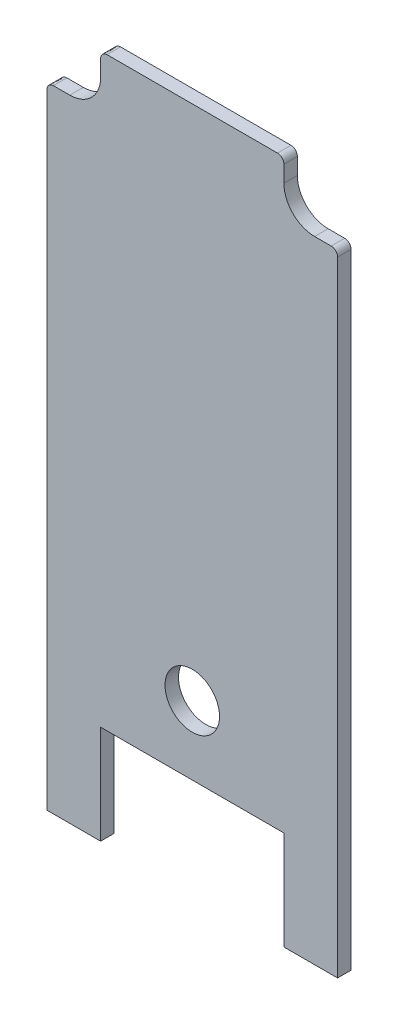
ISO-10303-21;
HEADER;
FILE_DESCRIPTION(('STEP AP214'),'2;1');
FILE_NAME('part.step','',(''),(''),'','','');
FILE_SCHEMA(('AUTOMOTIVE_DESIGN { 1 0 10303 214 1 1 1 1 }'));
ENDSEC;
DATA;
#1=APPLICATION_CONTEXT('core data for automotive mechanical design processes');
#2=APPLICATION_PROTOCOL_DEFINITION('international standard','automotive_design',2000,#1);
#3=PRODUCT_CONTEXT('',#1,'mechanical');
#4=PRODUCT('Part','Part','',(#3));
#5=PRODUCT_RELATED_PRODUCT_CATEGORY('part','',(#4));
#6=PRODUCT_DEFINITION_FORMATION('','',#4);
#7=PRODUCT_DEFINITION_CONTEXT('part definition',#1,'design');
#8=PRODUCT_DEFINITION('design','',#6,#7);
#9=PRODUCT_DEFINITION_SHAPE('','',#8);
#10=(LENGTH_UNIT() NAMED_UNIT(*) SI_UNIT(.MILLI.,.METRE.));
#11=(NAMED_UNIT(*) PLANE_ANGLE_UNIT() SI_UNIT($,.RADIAN.));
#12=(NAMED_UNIT(*) SI_UNIT($,.STERADIAN.) SOLID_ANGLE_UNIT());
#13=UNCERTAINTY_MEASURE_WITH_UNIT(LENGTH_MEASURE(1.E-05),#10,'distance_accuracy_value','');
#14=(GEOMETRIC_REPRESENTATION_CONTEXT(3) GLOBAL_UNCERTAINTY_ASSIGNED_CONTEXT((#13)) GLOBAL_UNIT_ASSIGNED_CONTEXT((#10,
#11,#12)) REPRESENTATION_CONTEXT('',''));
#15=CARTESIAN_POINT('',(0.,0.,0.));
#16=DIRECTION('',(0.,0.,1.));
#17=DIRECTION('',(1.,0.,0.));
#18=AXIS2_PLACEMENT_3D('',#15,#16,#17);
#19=CARTESIAN_POINT('',(16.17485166992,37.7205089948946,6.57));
#20=CARTESIAN_POINT('',(16.268017422358,37.7205089948946,6.57));
#21=CARTESIAN_POINT('',(16.450238191191,37.6884642471952,6.57));
#22=CARTESIAN_POINT('',(16.7185532302932,37.5185532302922,6.57));
#23=CARTESIAN_POINT('',(16.8884642471962,37.25023819119,6.57));
#24=CARTESIAN_POINT('',(16.9205089948956,37.068017422357,6.57));
#25=CARTESIAN_POINT('',(16.9205089948956,36.974851669919,6.57));
#26=B_SPLINE_CURVE_WITH_KNOTS('',3,(#19,#20,#21,#22,#23,#24,#25),.UNSPECIFIED.,.F.,.F.,(4,1,1,1,
4),(0.,0.25,0.5,0.75,1.),.UNSPECIFIED.);
#27=DIRECTION('',(0.,0.,-1.));
#28=VECTOR('',#27,1.);
#29=SURFACE_OF_LINEAR_EXTRUSION('',#26,#28);
#30=CARTESIAN_POINT('',(16.17485166992,37.7205089948946,5.));
#31=CARTESIAN_POINT('',(16.268017422358,37.7205089948946,5.));
#32=CARTESIAN_POINT('',(16.450238191191,37.6884642471952,5.));
#33=CARTESIAN_POINT('',(16.7185532302932,37.5185532302922,5.));
#34=CARTESIAN_POINT('',(16.8884642471962,37.25023819119,5.));
#35=CARTESIAN_POINT('',(16.9205089948956,37.068017422357,5.));
#36=CARTESIAN_POINT('',(16.9205089948956,36.974851669919,5.));
#37=B_SPLINE_CURVE_WITH_KNOTS('',3,(#30,#31,#32,#33,#34,#35,#36),.UNSPECIFIED.,.F.,.F.,(4,1,1,1,
4),(0.,0.25,0.5,0.75,1.),.UNSPECIFIED.);
#38=CARTESIAN_POINT('',(16.17485166992,37.7205089948946,5.));
#39=VERTEX_POINT('',#38);
#40=CARTESIAN_POINT('',(16.9205089948956,36.974851669919,5.));
#41=VERTEX_POINT('',#40);
#42=EDGE_CURVE('E285',#39,#41,#37,.T.);
#43=ORIENTED_EDGE('',*,*,#42,.F.);
#44=DIRECTION('',(0.,0.,-1.));
#45=VECTOR('',#44,1.);
#46=CARTESIAN_POINT('',(16.17485166992,37.7205089948946,6.57));
#47=LINE('',#46,#45);
#48=CARTESIAN_POINT('',(16.17485166992,37.7205089948946,6.57));
#49=VERTEX_POINT('',#48);
#50=EDGE_CURVE('E125',#49,#39,#47,.T.);
#51=ORIENTED_EDGE('',*,*,#50,.F.);
#52=CARTESIAN_POINT('',(16.9205089948956,36.974851669919,6.57));
#53=VERTEX_POINT('',#52);
#54=EDGE_CURVE('E230',#49,#53,#26,.T.);
#55=ORIENTED_EDGE('',*,*,#54,.T.);
#56=DIRECTION('',(0.,0.,-1.));
#57=VECTOR('',#56,1.);
#58=CARTESIAN_POINT('',(16.9205089948956,36.974851669919,6.57));
#59=LINE('',#58,#57);
#60=EDGE_CURVE('E223',#53,#41,#59,.T.);
#61=ORIENTED_EDGE('',*,*,#60,.T.);
#62=EDGE_LOOP('',(#43,#51,#55,#61));
#63=FACE_BOUND('',#62,.T.);
#64=ADVANCED_FACE('F115',(#63),#29,.T.);
#65=CARTESIAN_POINT('',(-5.84707923333038E-12,37.7205089948921,6.57));
#66=DIRECTION('',(-1.55010613301166E-13,1.,0.));
#67=DIRECTION('',(-1.,-1.55010613301166E-13,0.));
#68=AXIS2_PLACEMENT_3D('',#65,#66,#67);
#69=PLANE('',#68);
#70=DIRECTION('',(1.,1.55010613301166E-13,0.));
#71=VECTOR('',#70,1.);
#72=CARTESIAN_POINT('',(-5.84707923333038E-12,37.7205089948921,5.));
#73=LINE('',#72,#71);
#74=CARTESIAN_POINT('',(14.2500000000004,37.7205089948943,5.));
#75=VERTEX_POINT('',#74);
#76=EDGE_CURVE('E282',#75,#39,#73,.T.);
#77=ORIENTED_EDGE('',*,*,#76,.F.);
#78=DIRECTION('',(0.,0.,-1.));
#79=VECTOR('',#78,1.);
#80=CARTESIAN_POINT('',(14.2500000000004,37.7205089948943,6.57));
#81=LINE('',#80,#79);
#82=CARTESIAN_POINT('',(14.2500000000004,37.7205089948943,6.57));
#83=VERTEX_POINT('',#82);
#84=EDGE_CURVE('E186',#83,#75,#81,.T.);
#85=ORIENTED_EDGE('',*,*,#84,.F.);
#86=DIRECTION('',(1.,1.55010613301166E-13,0.));
#87=VECTOR('',#86,1.);
#88=CARTESIAN_POINT('',(-5.84707923333038E-12,37.7205089948921,6.57));
#89=LINE('',#88,#87);
#90=EDGE_CURVE('E472',#83,#49,#89,.T.);
#91=ORIENTED_EDGE('',*,*,#90,.T.);
#92=ORIENTED_EDGE('',*,*,#50,.T.);
#93=EDGE_LOOP('',(#77,#85,#91,#92));
#94=FACE_BOUND('',#93,.T.);
#95=ADVANCED_FACE('F471',(#94),#69,.T.);
#96=CARTESIAN_POINT('',(14.2500000000014,41.2999999999997,6.57));
#97=DIRECTION('',(0.,0.,-1.));
#98=DIRECTION('',(-1.,0.,0.));
#99=AXIS2_PLACEMENT_3D('',#96,#97,#98);
#100=CYLINDRICAL_SURFACE('',#99,3.57949100510564);
#101=CARTESIAN_POINT('',(14.2500000000014,41.2999999999997,5.));
#102=DIRECTION('',(0.,0.,1.));
#103=DIRECTION('',(1.,0.,0.));
#104=AXIS2_PLACEMENT_3D('',#101,#102,#103);
#105=CIRCLE('',#104,3.57949100510564);
#106=CARTESIAN_POINT('',(10.6705089948956,41.2999999999997,5.));
#107=VERTEX_POINT('',#106);
#108=EDGE_CURVE('E279',#107,#75,#105,.T.);
#109=ORIENTED_EDGE('',*,*,#108,.F.);
#110=DIRECTION('',(0.,0.,-1.));
#111=VECTOR('',#110,1.);
#112=CARTESIAN_POINT('',(10.6705089948956,41.2999999999997,6.57));
#113=LINE('',#112,#111);
#114=CARTESIAN_POINT('',(10.6705089948956,41.2999999999997,6.57));
#115=VERTEX_POINT('',#114);
#116=EDGE_CURVE('E189',#115,#107,#113,.T.);
#117=ORIENTED_EDGE('',*,*,#116,.F.);
#118=CARTESIAN_POINT('',(14.2500000000014,41.2999999999997,6.57));
#119=DIRECTION('',(0.,0.,1.));
#120=DIRECTION('',(1.,0.,0.));
#121=AXIS2_PLACEMENT_3D('',#118,#119,#120);
#122=CIRCLE('',#121,3.57949100510564);
#123=EDGE_CURVE('E467',#115,#83,#122,.T.);
#124=ORIENTED_EDGE('',*,*,#123,.T.);
#125=ORIENTED_EDGE('',*,*,#84,.T.);
#126=EDGE_LOOP('',(#109,#117,#124,#125));
#127=FACE_BOUND('',#126,.T.);
#128=ADVANCED_FACE('F464',(#127),#100,.F.);
#129=CARTESIAN_POINT('',(10.6705089948951,-1.25014813174112E-13,6.57));
#130=DIRECTION('',(1.,0.,0.));
#131=DIRECTION('',(0.,1.,0.));
#132=AXIS2_PLACEMENT_3D('',#129,#130,#131);
#133=PLANE('',#132);
#134=DIRECTION('',(0.,-1.,0.));
#135=VECTOR('',#134,1.);
#136=CARTESIAN_POINT('',(10.6705089948951,-1.25014813174112E-13,5.));
#137=LINE('',#136,#135);
#138=CARTESIAN_POINT('',(10.6705089948956,43.2248516699192,5.));
#139=VERTEX_POINT('',#138);
#140=EDGE_CURVE('E273',#139,#107,#137,.T.);
#141=ORIENTED_EDGE('',*,*,#140,.F.);
#142=DIRECTION('',(0.,0.,-1.));
#143=VECTOR('',#142,1.);
#144=CARTESIAN_POINT('',(10.6705089948956,43.2248516699192,6.57));
#145=LINE('',#144,#143);
#146=CARTESIAN_POINT('',(10.6705089948956,43.2248516699192,6.57));
#147=VERTEX_POINT('',#146);
#148=EDGE_CURVE('E192',#147,#139,#145,.T.);
#149=ORIENTED_EDGE('',*,*,#148,.F.);
#150=DIRECTION('',(0.,-1.,0.));
#151=VECTOR('',#150,1.);
#152=CARTESIAN_POINT('',(10.6705089948951,-1.25014813174112E-13,6.57));
#153=LINE('',#152,#151);
#154=EDGE_CURVE('E514',#147,#115,#153,.T.);
#155=ORIENTED_EDGE('',*,*,#154,.T.);
#156=ORIENTED_EDGE('',*,*,#116,.T.);
#157=EDGE_LOOP('',(#141,#149,#155,#156));
#158=FACE_BOUND('',#157,.T.);
#159=ADVANCED_FACE('F460',(#158),#133,.T.);
#160=CARTESIAN_POINT('',(9.92485166992008,43.9705089948948,6.57));
#161=CARTESIAN_POINT('',(10.0180174223581,43.9705089948948,6.57));
#162=CARTESIAN_POINT('',(10.2002381911911,43.9384642471954,6.57));
#163=CARTESIAN_POINT('',(10.4685532302933,43.7685532302924,6.57));
#164=CARTESIAN_POINT('',(10.6384642471963,43.5002381911902,6.57));
#165=CARTESIAN_POINT('',(10.6705089948956,43.3180174223572,6.57));
#166=CARTESIAN_POINT('',(10.6705089948956,43.2248516699192,6.57));
#167=B_SPLINE_CURVE_WITH_KNOTS('',3,(#160,#161,#162,#163,#164,#165,#166),.UNSPECIFIED.,.F.,.F.,
(4,1,1,1,4),(0.,0.25,0.5,0.75,1.),.UNSPECIFIED.);
#168=DIRECTION('',(0.,0.,-1.));
#169=VECTOR('',#168,1.);
#170=SURFACE_OF_LINEAR_EXTRUSION('',#167,#169);
#171=CARTESIAN_POINT('',(9.92485166992008,43.9705089948948,5.));
#172=CARTESIAN_POINT('',(10.0180174223581,43.9705089948948,5.));
#173=CARTESIAN_POINT('',(10.2002381911911,43.9384642471954,5.));
#174=CARTESIAN_POINT('',(10.4685532302933,43.7685532302924,5.));
#175=CARTESIAN_POINT('',(10.6384642471963,43.5002381911902,5.));
#176=CARTESIAN_POINT('',(10.6705089948956,43.3180174223572,5.));
#177=CARTESIAN_POINT('',(10.6705089948956,43.2248516699192,5.));
#178=B_SPLINE_CURVE_WITH_KNOTS('',3,(#171,#172,#173,#174,#175,#176,#177),.UNSPECIFIED.,.F.,.F.,
(4,1,1,1,4),(0.,0.25,0.5,0.75,1.),.UNSPECIFIED.);
#179=CARTESIAN_POINT('',(9.92485166992008,43.9705089948948,5.));
#180=VERTEX_POINT('',#179);
#181=EDGE_CURVE('E268',#180,#139,#178,.T.);
#182=ORIENTED_EDGE('',*,*,#181,.F.);
#183=DIRECTION('',(0.,0.,-1.));
#184=VECTOR('',#183,1.);
#185=CARTESIAN_POINT('',(9.92485166992008,43.9705089948948,6.57));
#186=LINE('',#185,#184);
#187=CARTESIAN_POINT('',(9.92485166992008,43.9705089948948,6.57));
#188=VERTEX_POINT('',#187);
#189=EDGE_CURVE('E195',#188,#180,#186,.T.);
#190=ORIENTED_EDGE('',*,*,#189,.F.);
#191=EDGE_CURVE('E456',#188,#147,#167,.T.);
#192=ORIENTED_EDGE('',*,*,#191,.T.);
#193=ORIENTED_EDGE('',*,*,#148,.T.);
#194=EDGE_LOOP('',(#182,#190,#192,#193));
#195=FACE_BOUND('',#194,.T.);
#196=ADVANCED_FACE('F454',(#195),#170,.T.);
#197=CARTESIAN_POINT('',(7.3780052006081E-13,43.9705089948949,6.57));
#198=DIRECTION('',(0.,1.,0.));
#199=DIRECTION('',(-1.,0.,0.));
#200=AXIS2_PLACEMENT_3D('',#197,#198,#199);
#201=PLANE('',#200);
#202=DIRECTION('',(1.,0.,0.));
#203=VECTOR('',#202,1.);
#204=CARTESIAN_POINT('',(7.3780052006081E-13,43.9705089948949,5.));
#205=LINE('',#204,#203);
#206=CARTESIAN_POINT('',(-9.92485166991887,43.9705089948951,5.));
#207=VERTEX_POINT('',#206);
#208=EDGE_CURVE('E262',#207,#180,#205,.T.);
#209=ORIENTED_EDGE('',*,*,#208,.F.);
#210=DIRECTION('',(0.,0.,-1.));
#211=VECTOR('',#210,1.);
#212=CARTESIAN_POINT('',(-9.92485166991887,43.9705089948951,6.57));
#213=LINE('',#212,#211);
#214=CARTESIAN_POINT('',(-9.92485166991887,43.9705089948951,6.57));
#215=VERTEX_POINT('',#214);
#216=EDGE_CURVE('E198',#215,#207,#213,.T.);
#217=ORIENTED_EDGE('',*,*,#216,.F.);
#218=DIRECTION('',(1.,0.,0.));
#219=VECTOR('',#218,1.);
#220=CARTESIAN_POINT('',(7.3780052006081E-13,43.9705089948949,6.57));
#221=LINE('',#220,#219);
#222=EDGE_CURVE('E353',#215,#188,#221,.T.);
#223=ORIENTED_EDGE('',*,*,#222,.T.);
#224=ORIENTED_EDGE('',*,*,#189,.T.);
#225=EDGE_LOOP('',(#209,#217,#223,#224));
#226=FACE_BOUND('',#225,.T.);
#227=ADVANCED_FACE('F342',(#226),#201,.T.);
#228=CARTESIAN_POINT('',(-10.6705089948944,43.2248516699195,6.57));
#229=CARTESIAN_POINT('',(-10.6705089948944,43.3180174223576,6.57));
#230=CARTESIAN_POINT('',(-10.6384642471951,43.5002381911905,6.57));
#231=CARTESIAN_POINT('',(-10.4685532302921,43.7685532302927,6.57));
#232=CARTESIAN_POINT('',(-10.2002381911899,43.9384642471958,6.57));
#233=CARTESIAN_POINT('',(-10.0180174223569,43.9705089948951,6.57));
#234=CARTESIAN_POINT('',(-9.92485166991887,43.9705089948951,6.57));
#235=B_SPLINE_CURVE_WITH_KNOTS('',3,(#228,#229,#230,#231,#232,#233,#234),.UNSPECIFIED.,.F.,.F.,
(4,1,1,1,4),(0.,0.25,0.5,0.75,1.),.UNSPECIFIED.);
#236=DIRECTION('',(0.,0.,-1.));
#237=VECTOR('',#236,1.);
#238=SURFACE_OF_LINEAR_EXTRUSION('',#235,#237);
#239=CARTESIAN_POINT('',(-10.6705089948944,43.2248516699195,5.));
#240=CARTESIAN_POINT('',(-10.6705089948944,43.3180174223576,5.));
#241=CARTESIAN_POINT('',(-10.6384642471951,43.5002381911905,5.));
#242=CARTESIAN_POINT('',(-10.4685532302921,43.7685532302927,5.));
#243=CARTESIAN_POINT('',(-10.2002381911899,43.9384642471958,5.));
#244=CARTESIAN_POINT('',(-10.0180174223569,43.9705089948951,5.));
#245=CARTESIAN_POINT('',(-9.92485166991887,43.9705089948951,5.));
#246=B_SPLINE_CURVE_WITH_KNOTS('',3,(#239,#240,#241,#242,#243,#244,#245),.UNSPECIFIED.,.F.,.F.,
(4,1,1,1,4),(0.,0.25,0.5,0.75,1.),.UNSPECIFIED.);
#247=CARTESIAN_POINT('',(-10.6705089948944,43.2248516699195,5.));
#248=VERTEX_POINT('',#247);
#249=EDGE_CURVE('E257',#248,#207,#246,.T.);
#250=ORIENTED_EDGE('',*,*,#249,.F.);
#251=DIRECTION('',(0.,0.,-1.));
#252=VECTOR('',#251,1.);
#253=CARTESIAN_POINT('',(-10.6705089948944,43.2248516699195,6.57));
#254=LINE('',#253,#252);
#255=CARTESIAN_POINT('',(-10.6705089948944,43.2248516699195,6.57));
#256=VERTEX_POINT('',#255);
#257=EDGE_CURVE('E201',#256,#248,#254,.T.);
#258=ORIENTED_EDGE('',*,*,#257,.F.);
#259=EDGE_CURVE('E345',#256,#215,#235,.T.);
#260=ORIENTED_EDGE('',*,*,#259,.T.);
#261=ORIENTED_EDGE('',*,*,#216,.T.);
#262=EDGE_LOOP('',(#250,#258,#260,#261));
#263=FACE_BOUND('',#262,.T.);
#264=ADVANCED_FACE('F337',(#263),#238,.T.);
#265=CARTESIAN_POINT('',(-10.6705089948839,-2.59646150438281E-12,6.57));
#266=DIRECTION('',(-1.,-2.43330613903021E-13,0.));
#267=DIRECTION('',(2.43330613903021E-13,-1.,0.));
#268=AXIS2_PLACEMENT_3D('',#265,#266,#267);
#269=PLANE('',#268);
#270=DIRECTION('',(-2.43330613903021E-13,1.,0.));
#271=VECTOR('',#270,1.);
#272=CARTESIAN_POINT('',(-10.6705089948839,-2.59646150438281E-12,5.));
#273=LINE('',#272,#271);
#274=CARTESIAN_POINT('',(-10.670508994894,41.3000000000002,5.));
#275=VERTEX_POINT('',#274);
#276=EDGE_CURVE('E254',#275,#248,#273,.T.);
#277=ORIENTED_EDGE('',*,*,#276,.F.);
#278=DIRECTION('',(0.,0.,-1.));
#279=VECTOR('',#278,1.);
#280=CARTESIAN_POINT('',(-10.670508994894,41.3000000000002,6.57));
#281=LINE('',#280,#279);
#282=CARTESIAN_POINT('',(-10.670508994894,41.3000000000002,6.57));
#283=VERTEX_POINT('',#282);
#284=EDGE_CURVE('E204',#283,#275,#281,.T.);
#285=ORIENTED_EDGE('',*,*,#284,.F.);
#286=DIRECTION('',(-2.43330613903021E-13,1.,0.));
#287=VECTOR('',#286,1.);
#288=CARTESIAN_POINT('',(-10.6705089948839,-2.59646150438281E-12,6.57));
#289=LINE('',#288,#287);
#290=EDGE_CURVE('E352',#283,#256,#289,.T.);
#291=ORIENTED_EDGE('',*,*,#290,.T.);
#292=ORIENTED_EDGE('',*,*,#257,.T.);
#293=EDGE_LOOP('',(#277,#285,#291,#292));
#294=FACE_BOUND('',#293,.T.);
#295=ADVANCED_FACE('F333',(#294),#269,.T.);
#296=CARTESIAN_POINT('',(-14.2499999999986,41.3000000000003,6.57));
#297=DIRECTION('',(0.,0.,-1.));
#298=DIRECTION('',(-1.,0.,0.));
#299=AXIS2_PLACEMENT_3D('',#296,#297,#298);
#300=CYLINDRICAL_SURFACE('',#299,3.57949100510483);
#301=CARTESIAN_POINT('',(-14.2499999999986,41.3000000000003,5.));
#302=DIRECTION('',(0.,0.,1.));
#303=DIRECTION('',(1.,0.,0.));
#304=AXIS2_PLACEMENT_3D('',#301,#302,#303);
#305=CIRCLE('',#304,3.57949100510483);
#306=CARTESIAN_POINT('',(-14.2499999999995,37.7205089948953,5.));
#307=VERTEX_POINT('',#306);
#308=EDGE_CURVE('E251',#307,#275,#305,.T.);
#309=ORIENTED_EDGE('',*,*,#308,.F.);
#310=DIRECTION('',(0.,0.,-1.));
#311=VECTOR('',#310,1.);
#312=CARTESIAN_POINT('',(-14.2499999999995,37.7205089948953,6.57));
#313=LINE('',#312,#311);
#314=CARTESIAN_POINT('',(-14.2499999999995,37.7205089948953,6.57));
#315=VERTEX_POINT('',#314);
#316=EDGE_CURVE('E207',#315,#307,#313,.T.);
#317=ORIENTED_EDGE('',*,*,#316,.F.);
#318=CARTESIAN_POINT('',(-14.2499999999986,41.3000000000003,6.57));
#319=DIRECTION('',(0.,0.,1.));
#320=DIRECTION('',(1.,0.,0.));
#321=AXIS2_PLACEMENT_3D('',#318,#319,#320);
#322=CIRCLE('',#321,3.57949100510483);
#323=EDGE_CURVE('E359',#315,#283,#322,.T.);
#324=ORIENTED_EDGE('',*,*,#323,.T.);
#325=ORIENTED_EDGE('',*,*,#284,.T.);
#326=EDGE_LOOP('',(#309,#317,#324,#325));
#327=FACE_BOUND('',#326,.T.);
#328=ADVANCED_FACE('F329',(#327),#300,.F.);
#329=CARTESIAN_POINT('',(2.71957173643317E-13,37.7205089948952,6.57));
#330=DIRECTION('',(0.,1.,0.));
#331=DIRECTION('',(-1.,0.,0.));
#332=AXIS2_PLACEMENT_3D('',#329,#330,#331);
#333=PLANE('',#332);
#334=DIRECTION('',(1.,0.,0.));
#335=VECTOR('',#334,1.);
#336=CARTESIAN_POINT('',(2.71957173643317E-13,37.7205089948952,5.));
#337=LINE('',#336,#335);
#338=CARTESIAN_POINT('',(-16.174851669919,37.7205089948953,5.));
#339=VERTEX_POINT('',#338);
#340=EDGE_CURVE('E245',#339,#307,#337,.T.);
#341=ORIENTED_EDGE('',*,*,#340,.F.);
#342=DIRECTION('',(0.,0.,-1.));
#343=VECTOR('',#342,1.);
#344=CARTESIAN_POINT('',(-16.174851669919,37.7205089948953,6.57));
#345=LINE('',#344,#343);
#346=CARTESIAN_POINT('',(-16.174851669919,37.7205089948953,6.57));
#347=VERTEX_POINT('',#346);
#348=EDGE_CURVE('E210',#347,#339,#345,.T.);
#349=ORIENTED_EDGE('',*,*,#348,.F.);
#350=DIRECTION('',(1.,0.,0.));
#351=VECTOR('',#350,1.);
#352=CARTESIAN_POINT('',(2.71957173643317E-13,37.7205089948952,6.57));
#353=LINE('',#352,#351);
#354=EDGE_CURVE('E314',#347,#315,#353,.T.);
#355=ORIENTED_EDGE('',*,*,#354,.T.);
#356=ORIENTED_EDGE('',*,*,#316,.T.);
#357=EDGE_LOOP('',(#341,#349,#355,#356));
#358=FACE_BOUND('',#357,.T.);
#359=ADVANCED_FACE('F324',(#358),#333,.T.);
#360=CARTESIAN_POINT('',(-16.9205089948945,36.9748516699197,6.57));
#361=CARTESIAN_POINT('',(-16.9205089948945,37.0680174223578,6.57));
#362=CARTESIAN_POINT('',(-16.8884642471952,37.2502381911907,6.57));
#363=CARTESIAN_POINT('',(-16.7185532302921,37.5185532302929,6.57));
#364=CARTESIAN_POINT('',(-16.4502381911899,37.688464247196,6.57));
#365=CARTESIAN_POINT('',(-16.268017422357,37.7205089948953,6.57));
#366=CARTESIAN_POINT('',(-16.174851669919,37.7205089948953,6.57));
#367=B_SPLINE_CURVE_WITH_KNOTS('',3,(#360,#361,#362,#363,#364,#365,#366),.UNSPECIFIED.,.F.,.F.,
(4,1,1,1,4),(0.,0.25,0.5,0.75,1.),.UNSPECIFIED.);
#368=DIRECTION('',(0.,0.,-1.));
#369=VECTOR('',#368,1.);
#370=SURFACE_OF_LINEAR_EXTRUSION('',#367,#369);
#371=CARTESIAN_POINT('',(-16.9205089948945,36.9748516699197,5.));
#372=CARTESIAN_POINT('',(-16.9205089948945,37.0680174223578,5.));
#373=CARTESIAN_POINT('',(-16.8884642471952,37.2502381911907,5.));
#374=CARTESIAN_POINT('',(-16.7185532302921,37.5185532302929,5.));
#375=CARTESIAN_POINT('',(-16.4502381911899,37.688464247196,5.));
#376=CARTESIAN_POINT('',(-16.268017422357,37.7205089948953,5.));
#377=CARTESIAN_POINT('',(-16.174851669919,37.7205089948953,5.));
#378=B_SPLINE_CURVE_WITH_KNOTS('',3,(#371,#372,#373,#374,#375,#376,#377),.UNSPECIFIED.,.F.,.F.,
(4,1,1,1,4),(0.,0.25,0.5,0.75,1.),.UNSPECIFIED.);
#379=CARTESIAN_POINT('',(-16.9205089948945,36.9748516699197,5.));
#380=VERTEX_POINT('',#379);
#381=EDGE_CURVE('E167',#380,#339,#378,.T.);
#382=ORIENTED_EDGE('',*,*,#381,.F.);
#383=DIRECTION('',(0.,0.,-1.));
#384=VECTOR('',#383,1.);
#385=CARTESIAN_POINT('',(-16.9205089948945,36.9748516699197,6.57));
#386=LINE('',#385,#384);
#387=CARTESIAN_POINT('',(-16.9205089948945,36.9748516699197,6.57));
#388=VERTEX_POINT('',#387);
#389=EDGE_CURVE('E161',#388,#380,#386,.T.);
#390=ORIENTED_EDGE('',*,*,#389,.F.);
#391=EDGE_CURVE('E308',#388,#347,#367,.T.);
#392=ORIENTED_EDGE('',*,*,#391,.T.);
#393=ORIENTED_EDGE('',*,*,#348,.T.);
#394=EDGE_LOOP('',(#382,#390,#392,#393));
#395=FACE_BOUND('',#394,.T.);
#396=ADVANCED_FACE('F320',(#395),#370,.T.);
#397=CARTESIAN_POINT('',(-16.9205089948945,0.,6.57));
#398=DIRECTION('',(-1.,0.,0.));
#399=DIRECTION('',(0.,0.,1.));
#400=AXIS2_PLACEMENT_3D('',#397,#398,#399);
#401=PLANE('',#400);
#402=DIRECTION('',(0.,1.,0.));
#403=VECTOR('',#402,1.);
#404=CARTESIAN_POINT('',(-16.9205089948945,0.,5.));
#405=LINE('',#404,#403);
#406=CARTESIAN_POINT('',(-16.9205089948945,-35.7245089948948,5.));
#407=VERTEX_POINT('',#406);
#408=EDGE_CURVE('E153',#407,#380,#405,.T.);
#409=ORIENTED_EDGE('',*,*,#408,.F.);
#410=DIRECTION('',(0.,0.,-1.));
#411=VECTOR('',#410,1.);
#412=CARTESIAN_POINT('',(-16.9205089948945,-35.7245089948948,6.57));
#413=LINE('',#412,#411);
#414=CARTESIAN_POINT('',(-16.9205089948945,-35.7245089948948,6.57));
#415=VERTEX_POINT('',#414);
#416=EDGE_CURVE('E157',#415,#407,#413,.T.);
#417=ORIENTED_EDGE('',*,*,#416,.F.);
#418=DIRECTION('',(0.,1.,0.));
#419=VECTOR('',#418,1.);
#420=CARTESIAN_POINT('',(-16.9205089948945,0.,6.57));
#421=LINE('',#420,#419);
#422=EDGE_CURVE('E306',#415,#388,#421,.T.);
#423=ORIENTED_EDGE('',*,*,#422,.T.);
#424=ORIENTED_EDGE('',*,*,#389,.T.);
#425=EDGE_LOOP('',(#409,#417,#423,#424));
#426=FACE_BOUND('',#425,.T.);
#427=ADVANCED_FACE('F155',(#426),#401,.T.);
#428=CARTESIAN_POINT('',(0.,-24.2245089948949,6.57));
#429=DIRECTION('',(0.,1.,0.));
#430=DIRECTION('',(0.,0.,1.));
#431=AXIS2_PLACEMENT_3D('',#428,#429,#430);
#432=PLANE('',#431);
#433=DIRECTION('',(1.,0.,0.));
#434=VECTOR('',#433,1.);
#435=CARTESIAN_POINT('',(0.,-24.2245089948949,6.57));
#436=LINE('',#435,#434);
#437=CARTESIAN_POINT('',(-10.670508994894,-24.2245089948949,6.57));
#438=VERTEX_POINT('',#437);
#439=CARTESIAN_POINT('',(10.6705089948943,-24.224508994895,6.57));
#440=VERTEX_POINT('',#439);
#441=EDGE_CURVE('E303',#438,#440,#436,.T.);
#442=ORIENTED_EDGE('',*,*,#441,.F.);
#443=DIRECTION('',(0.,0.,-1.));
#444=VECTOR('',#443,1.);
#445=CARTESIAN_POINT('',(-10.670508994894,-24.2245089948949,6.57));
#446=LINE('',#445,#444);
#447=CARTESIAN_POINT('',(-10.670508994894,-24.2245089948949,5.));
#448=VERTEX_POINT('',#447);
#449=EDGE_CURVE('E12',#438,#448,#446,.T.);
#450=ORIENTED_EDGE('',*,*,#449,.T.);
#451=DIRECTION('',(1.,0.,0.));
#452=VECTOR('',#451,1.);
#453=CARTESIAN_POINT('',(0.,-24.2245089948949,5.));
#454=LINE('',#453,#452);
#455=CARTESIAN_POINT('',(10.6705089948943,-24.224508994895,5.));
#456=VERTEX_POINT('',#455);
#457=EDGE_CURVE('E166',#448,#456,#454,.T.);
#458=ORIENTED_EDGE('',*,*,#457,.T.);
#459=DIRECTION('',(0.,0.,-1.));
#460=VECTOR('',#459,1.);
#461=CARTESIAN_POINT('',(10.6705089948943,-24.224508994895,6.57));
#462=LINE('',#461,#460);
#463=EDGE_CURVE('E214',#440,#456,#462,.T.);
#464=ORIENTED_EDGE('',*,*,#463,.F.);
#465=EDGE_LOOP('',(#442,#450,#458,#464));
#466=FACE_BOUND('',#465,.T.);
#467=ADVANCED_FACE('F489',(#466),#432,.F.);
#468=CARTESIAN_POINT('',(10.6705089948949,-2.86508528419459E-13,6.57));
#469=DIRECTION('',(1.,0.,0.));
#470=DIRECTION('',(0.,1.,0.));
#471=AXIS2_PLACEMENT_3D('',#468,#469,#470);
#472=PLANE('',#471);
#473=DIRECTION('',(0.,-1.,0.));
#474=VECTOR('',#473,1.);
#475=CARTESIAN_POINT('',(10.6705089948949,-2.86508528419459E-13,5.));
#476=LINE('',#475,#474);
#477=CARTESIAN_POINT('',(10.670508994894,-35.7245089948948,5.));
#478=VERTEX_POINT('',#477);
#479=EDGE_CURVE('E237',#456,#478,#476,.T.);
#480=ORIENTED_EDGE('',*,*,#479,.T.);
#481=DIRECTION('',(0.,0.,-1.));
#482=VECTOR('',#481,1.);
#483=CARTESIAN_POINT('',(10.670508994894,-35.7245089948948,6.57));
#484=LINE('',#483,#482);
#485=CARTESIAN_POINT('',(10.670508994894,-35.7245089948948,6.57));
#486=VERTEX_POINT('',#485);
#487=EDGE_CURVE('E217',#486,#478,#484,.T.);
#488=ORIENTED_EDGE('',*,*,#487,.F.);
#489=DIRECTION('',(0.,-1.,0.));
#490=VECTOR('',#489,1.);
#491=CARTESIAN_POINT('',(10.6705089948949,-2.86508528419459E-13,6.57));
#492=LINE('',#491,#490);
#493=EDGE_CURVE('E300',#440,#486,#492,.T.);
#494=ORIENTED_EDGE('',*,*,#493,.F.);
#495=ORIENTED_EDGE('',*,*,#463,.T.);
#496=EDGE_LOOP('',(#480,#488,#494,#495));
#497=FACE_BOUND('',#496,.T.);
#498=ADVANCED_FACE('F484',(#497),#472,.F.);
#499=CARTESIAN_POINT('',(0.,-35.7245089948948,6.57));
#500=DIRECTION('',(0.,-1.,0.));
#501=DIRECTION('',(0.,0.,-1.));
#502=AXIS2_PLACEMENT_3D('',#499,#500,#501);
#503=PLANE('',#502);
#504=DIRECTION('',(-1.,0.,0.));
#505=VECTOR('',#504,1.);
#506=CARTESIAN_POINT('',(0.,-35.7245089948948,5.));
#507=LINE('',#506,#505);
#508=CARTESIAN_POINT('',(16.9205089948945,-35.7245089948948,5.));
#509=VERTEX_POINT('',#508);
#510=EDGE_CURVE('E234',#509,#478,#507,.T.);
#511=ORIENTED_EDGE('',*,*,#510,.F.);
#512=DIRECTION('',(0.,0.,-1.));
#513=VECTOR('',#512,1.);
#514=CARTESIAN_POINT('',(16.9205089948945,-35.7245089948948,6.57));
#515=LINE('',#514,#513);
#516=CARTESIAN_POINT('',(16.9205089948945,-35.7245089948948,6.57));
#517=VERTEX_POINT('',#516);
#518=EDGE_CURVE('E220',#517,#509,#515,.T.);
#519=ORIENTED_EDGE('',*,*,#518,.F.);
#520=DIRECTION('',(-1.,0.,0.));
#521=VECTOR('',#520,1.);
#522=CARTESIAN_POINT('',(0.,-35.7245089948948,6.57));
#523=LINE('',#522,#521);
#524=EDGE_CURVE('E297',#517,#486,#523,.T.);
#525=ORIENTED_EDGE('',*,*,#524,.T.);
#526=ORIENTED_EDGE('',*,*,#487,.T.);
#527=EDGE_LOOP('',(#511,#519,#525,#526));
#528=FACE_BOUND('',#527,.T.);
#529=ADVANCED_FACE('F480',(#528),#503,.T.);
#530=CARTESIAN_POINT('',(16.920508994895,-2.3740530177123E-13,6.57));
#531=DIRECTION('',(1.,0.,0.));
#532=DIRECTION('',(0.,1.,0.));
#533=AXIS2_PLACEMENT_3D('',#530,#531,#532);
#534=PLANE('',#533);
#535=DIRECTION('',(0.,-1.,0.));
#536=VECTOR('',#535,1.);
#537=CARTESIAN_POINT('',(16.920508994895,-2.3740530177123E-13,5.));
#538=LINE('',#537,#536);
#539=EDGE_CURVE('E231',#41,#509,#538,.T.);
#540=ORIENTED_EDGE('',*,*,#539,.F.);
#541=ORIENTED_EDGE('',*,*,#60,.F.);
#542=DIRECTION('',(0.,-1.,0.));
#543=VECTOR('',#542,1.);
#544=CARTESIAN_POINT('',(16.920508994895,-2.3740530177123E-13,6.57));
#545=LINE('',#544,#543);
#546=EDGE_CURVE('E294',#53,#517,#545,.T.);
#547=ORIENTED_EDGE('',*,*,#546,.T.);
#548=ORIENTED_EDGE('',*,*,#518,.T.);
#549=EDGE_LOOP('',(#540,#541,#547,#548));
#550=FACE_BOUND('',#549,.T.);
#551=ADVANCED_FACE('F475',(#550),#534,.T.);
#552=CARTESIAN_POINT('',(0.,-16.2245089948949,6.57));
#553=DIRECTION('',(0.,0.,-1.));
#554=DIRECTION('',(-1.,0.,0.));
#555=AXIS2_PLACEMENT_3D('',#552,#553,#554);
#556=CYLINDRICAL_SURFACE('',#555,3.175);
#557=CARTESIAN_POINT('',(0.,-16.2245089948949,6.57));
#558=DIRECTION('',(0.,0.,1.));
#559=DIRECTION('',(1.,0.,0.));
#560=AXIS2_PLACEMENT_3D('',#557,#558,#559);
#561=CIRCLE('',#560,3.175);
#562=CARTESIAN_POINT('',(3.175,-16.2245089948949,6.57));
#563=VERTEX_POINT('',#562);
#564=EDGE_CURVE('E226',#563,#563,#561,.T.);
#565=ORIENTED_EDGE('',*,*,#564,.T.);
#566=EDGE_LOOP('',(#565));
#567=FACE_BOUND('',#566,.T.);
#568=CARTESIAN_POINT('',(0.,-16.2245089948949,5.));
#569=DIRECTION('',(0.,0.,1.));
#570=DIRECTION('',(1.,0.,0.));
#571=AXIS2_PLACEMENT_3D('',#568,#569,#570);
#572=CIRCLE('',#571,3.175);
#573=CARTESIAN_POINT('',(3.175,-16.2245089948949,5.));
#574=VERTEX_POINT('',#573);
#575=EDGE_CURVE('E227',#574,#574,#572,.T.);
#576=ORIENTED_EDGE('',*,*,#575,.F.);
#577=EDGE_LOOP('',(#576));
#578=FACE_BOUND('',#577,.T.);
#579=ADVANCED_FACE('F590',(#567,#578),#556,.F.);
#580=CARTESIAN_POINT('',(0.,0.,6.57));
#581=DIRECTION('',(0.,0.,1.));
#582=DIRECTION('',(1.,0.,0.));
#583=AXIS2_PLACEMENT_3D('',#580,#581,#582);
#584=PLANE('',#583);
#585=ORIENTED_EDGE('',*,*,#54,.F.);
#586=ORIENTED_EDGE('',*,*,#90,.F.);
#587=ORIENTED_EDGE('',*,*,#123,.F.);
#588=ORIENTED_EDGE('',*,*,#154,.F.);
#589=ORIENTED_EDGE('',*,*,#191,.F.);
#590=ORIENTED_EDGE('',*,*,#222,.F.);
#591=ORIENTED_EDGE('',*,*,#259,.F.);
#592=ORIENTED_EDGE('',*,*,#290,.F.);
#593=ORIENTED_EDGE('',*,*,#323,.F.);
#594=ORIENTED_EDGE('',*,*,#354,.F.);
#595=ORIENTED_EDGE('',*,*,#391,.F.);
#596=ORIENTED_EDGE('',*,*,#422,.F.);
#597=DIRECTION('',(1.,0.,0.));
#598=VECTOR('',#597,1.);
#599=CARTESIAN_POINT('',(-16.9205089948945,-35.7245089948948,6.57));
#600=LINE('',#599,#598);
#601=CARTESIAN_POINT('',(-10.670508994894,-35.7245089948948,6.57));
#602=VERTEX_POINT('',#601);
#603=EDGE_CURVE('E172',#415,#602,#600,.T.);
#604=ORIENTED_EDGE('',*,*,#603,.T.);
#605=DIRECTION('',(0.,-1.,0.));
#606=VECTOR('',#605,1.);
#607=CARTESIAN_POINT('',(-10.670508994894,-24.2245089948949,6.57));
#608=LINE('',#607,#606);
#609=EDGE_CURVE('E173',#438,#602,#608,.T.);
#610=ORIENTED_EDGE('',*,*,#609,.F.);
#611=ORIENTED_EDGE('',*,*,#441,.T.);
#612=ORIENTED_EDGE('',*,*,#493,.T.);
#613=ORIENTED_EDGE('',*,*,#524,.F.);
#614=ORIENTED_EDGE('',*,*,#546,.F.);
#615=EDGE_LOOP('',(#585,#586,#587,#588,#589,#590,#591,#592,#593,#594,#595,#596,#604,#610,#611,
#612,#613,#614));
#616=FACE_BOUND('',#615,.T.);
#617=ORIENTED_EDGE('',*,*,#564,.F.);
#618=EDGE_LOOP('',(#617));
#619=FACE_BOUND('',#618,.T.);
#620=ADVANCED_FACE('F376',(#616,#619),#584,.T.);
#621=CARTESIAN_POINT('',(0.,0.,5.));
#622=DIRECTION('',(0.,0.,1.));
#623=DIRECTION('',(1.,0.,0.));
#624=AXIS2_PLACEMENT_3D('',#621,#622,#623);
#625=PLANE('',#624);
#626=ORIENTED_EDGE('',*,*,#42,.T.);
#627=ORIENTED_EDGE('',*,*,#539,.T.);
#628=ORIENTED_EDGE('',*,*,#510,.T.);
#629=ORIENTED_EDGE('',*,*,#479,.F.);
#630=ORIENTED_EDGE('',*,*,#457,.F.);
#631=DIRECTION('',(0.,-1.,0.));
#632=VECTOR('',#631,1.);
#633=CARTESIAN_POINT('',(-10.670508994894,-24.2245089948949,5.));
#634=LINE('',#633,#632);
#635=CARTESIAN_POINT('',(-10.670508994894,-35.7245089948948,5.));
#636=VERTEX_POINT('',#635);
#637=EDGE_CURVE('E178',#448,#636,#634,.T.);
#638=ORIENTED_EDGE('',*,*,#637,.T.);
#639=DIRECTION('',(1.,0.,0.));
#640=VECTOR('',#639,1.);
#641=CARTESIAN_POINT('',(-16.9205089948945,-35.7245089948948,5.));
#642=LINE('',#641,#640);
#643=EDGE_CURVE('E170',#407,#636,#642,.T.);
#644=ORIENTED_EDGE('',*,*,#643,.F.);
#645=ORIENTED_EDGE('',*,*,#408,.T.);
#646=ORIENTED_EDGE('',*,*,#381,.T.);
#647=ORIENTED_EDGE('',*,*,#340,.T.);
#648=ORIENTED_EDGE('',*,*,#308,.T.);
#649=ORIENTED_EDGE('',*,*,#276,.T.);
#650=ORIENTED_EDGE('',*,*,#249,.T.);
#651=ORIENTED_EDGE('',*,*,#208,.T.);
#652=ORIENTED_EDGE('',*,*,#181,.T.);
#653=ORIENTED_EDGE('',*,*,#140,.T.);
#654=ORIENTED_EDGE('',*,*,#108,.T.);
#655=ORIENTED_EDGE('',*,*,#76,.T.);
#656=EDGE_LOOP('',(#626,#627,#628,#629,#630,#638,#644,#645,#646,#647,#648,#649,#650,#651,#652,
#653,#654,#655));
#657=FACE_BOUND('',#656,.T.);
#658=ORIENTED_EDGE('',*,*,#575,.T.);
#659=EDGE_LOOP('',(#658));
#660=FACE_BOUND('',#659,.T.);
#661=ADVANCED_FACE('F175',(#657,#660),#625,.F.);
#662=CARTESIAN_POINT('',(-10.670508994894,-24.2245089948949,6.57));
#663=DIRECTION('',(1.,0.,0.));
#664=DIRECTION('',(0.,0.,-1.));
#665=AXIS2_PLACEMENT_3D('',#662,#663,#664);
#666=PLANE('',#665);
#667=ORIENTED_EDGE('',*,*,#637,.F.);
#668=ORIENTED_EDGE('',*,*,#449,.F.);
#669=ORIENTED_EDGE('',*,*,#609,.T.);
#670=DIRECTION('',(0.,0.,-1.));
#671=VECTOR('',#670,1.);
#672=CARTESIAN_POINT('',(-10.670508994894,-35.7245089948948,6.57));
#673=LINE('',#672,#671);
#674=EDGE_CURVE('E119',#602,#636,#673,.T.);
#675=ORIENTED_EDGE('',*,*,#674,.T.);
#676=EDGE_LOOP('',(#667,#668,#669,#675));
#677=FACE_BOUND('',#676,.T.);
#678=ADVANCED_FACE('F490',(#677),#666,.T.);
#679=CARTESIAN_POINT('',(-16.9205089948945,-35.7245089948948,6.57));
#680=DIRECTION('',(0.,1.,0.));
#681=DIRECTION('',(0.,0.,1.));
#682=AXIS2_PLACEMENT_3D('',#679,#680,#681);
#683=PLANE('',#682);
#684=ORIENTED_EDGE('',*,*,#643,.T.);
#685=ORIENTED_EDGE('',*,*,#674,.F.);
#686=ORIENTED_EDGE('',*,*,#603,.F.);
#687=ORIENTED_EDGE('',*,*,#416,.T.);
#688=EDGE_LOOP('',(#684,#685,#686,#687));
#689=FACE_BOUND('',#688,.T.);
#690=ADVANCED_FACE('F117',(#689),#683,.F.);
#691=CLOSED_SHELL('',(#64,#95,#128,#159,#196,#227,#264,#295,#328,#359,#396,#427,#467,#498,#529,
#551,#579,#620,#661,#678,#690));
#692=MANIFOLD_SOLID_BREP('B2',#691);
#693=ADVANCED_BREP_SHAPE_REPRESENTATION('',(#18,#692),#14);
#694=SHAPE_DEFINITION_REPRESENTATION(#9,#693);
ENDSEC;
END-ISO-10303-21;
